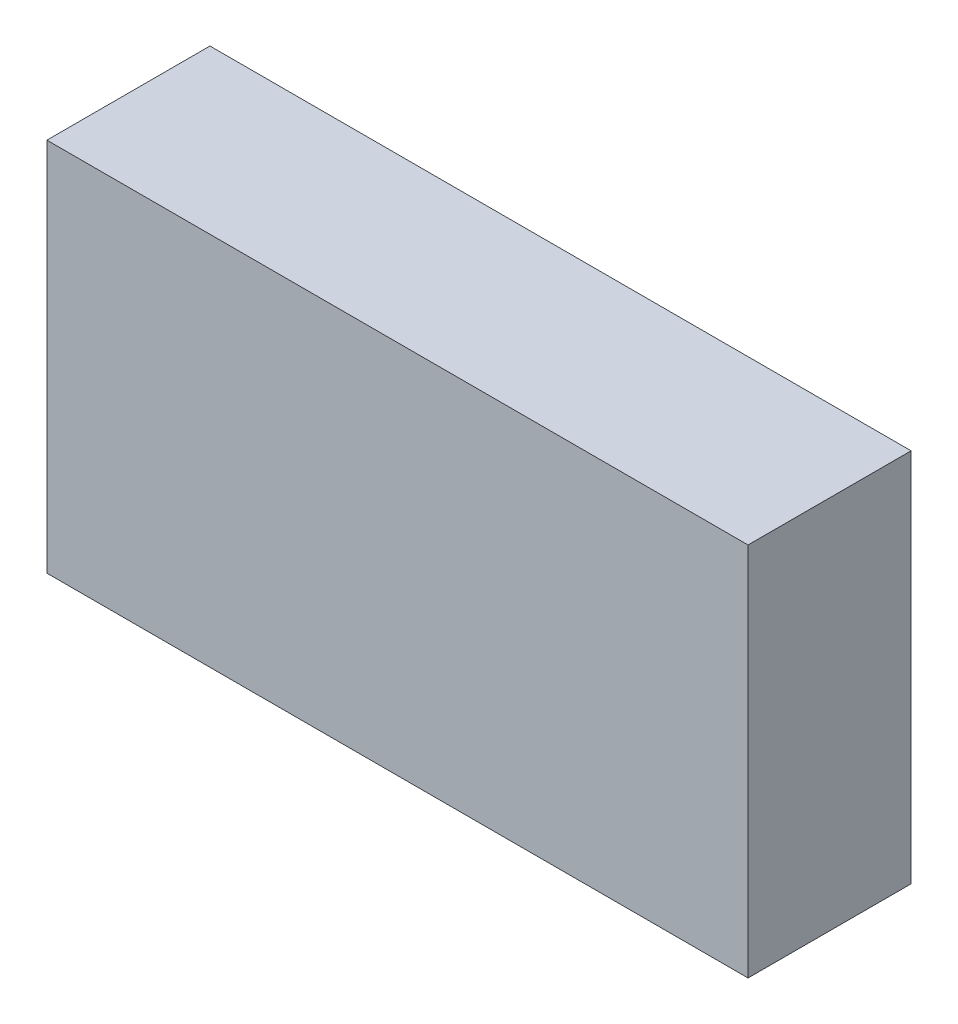
ISO-10303-21;
HEADER;
FILE_DESCRIPTION(('STEP AP214'),'2;1');
FILE_NAME('part.step','',(''),(''),'','','');
FILE_SCHEMA(('AUTOMOTIVE_DESIGN { 1 0 10303 214 1 1 1 1 }'));
ENDSEC;
DATA;
#1=APPLICATION_CONTEXT('core data for automotive mechanical design processes');
#2=APPLICATION_PROTOCOL_DEFINITION('international standard','automotive_design',2000,#1);
#3=PRODUCT_CONTEXT('',#1,'mechanical');
#4=PRODUCT('Part','Part','',(#3));
#5=PRODUCT_RELATED_PRODUCT_CATEGORY('part','',(#4));
#6=PRODUCT_DEFINITION_FORMATION('','',#4);
#7=PRODUCT_DEFINITION_CONTEXT('part definition',#1,'design');
#8=PRODUCT_DEFINITION('design','',#6,#7);
#9=PRODUCT_DEFINITION_SHAPE('','',#8);
#10=(LENGTH_UNIT() NAMED_UNIT(*) SI_UNIT(.MILLI.,.METRE.));
#11=(NAMED_UNIT(*) PLANE_ANGLE_UNIT() SI_UNIT($,.RADIAN.));
#12=(NAMED_UNIT(*) SI_UNIT($,.STERADIAN.) SOLID_ANGLE_UNIT());
#13=UNCERTAINTY_MEASURE_WITH_UNIT(LENGTH_MEASURE(1.E-05),#10,'distance_accuracy_value','');
#14=(GEOMETRIC_REPRESENTATION_CONTEXT(3) GLOBAL_UNCERTAINTY_ASSIGNED_CONTEXT((#13)) GLOBAL_UNIT_ASSIGNED_CONTEXT((#10,
#11,#12)) REPRESENTATION_CONTEXT('',''));
#15=CARTESIAN_POINT('',(0.,0.,0.));
#16=DIRECTION('',(0.,0.,1.));
#17=DIRECTION('',(1.,0.,0.));
#18=AXIS2_PLACEMENT_3D('',#15,#16,#17);
#19=CARTESIAN_POINT('',(0.,0.,50.));
#20=DIRECTION('',(1.,0.,0.));
#21=DIRECTION('',(0.,0.,-1.));
#22=AXIS2_PLACEMENT_3D('',#19,#20,#21);
#23=PLANE('',#22);
#24=DIRECTION('',(0.,-1.,0.));
#25=VECTOR('',#24,1.);
#26=CARTESIAN_POINT('',(0.,0.,0.));
#27=LINE('',#26,#25);
#28=CARTESIAN_POINT('',(0.,115.,0.));
#29=VERTEX_POINT('',#28);
#30=CARTESIAN_POINT('',(0.,0.,0.));
#31=VERTEX_POINT('',#30);
#32=EDGE_CURVE('E107',#29,#31,#27,.T.);
#33=ORIENTED_EDGE('',*,*,#32,.T.);
#34=DIRECTION('',(0.,0.,-1.));
#35=VECTOR('',#34,1.);
#36=CARTESIAN_POINT('',(0.,0.,50.));
#37=LINE('',#36,#35);
#38=CARTESIAN_POINT('',(0.,0.,50.));
#39=VERTEX_POINT('',#38);
#40=EDGE_CURVE('E11',#39,#31,#37,.T.);
#41=ORIENTED_EDGE('',*,*,#40,.F.);
#42=DIRECTION('',(0.,-1.,0.));
#43=VECTOR('',#42,1.);
#44=CARTESIAN_POINT('',(0.,0.,50.));
#45=LINE('',#44,#43);
#46=CARTESIAN_POINT('',(0.,115.,50.));
#47=VERTEX_POINT('',#46);
#48=EDGE_CURVE('E91',#47,#39,#45,.T.);
#49=ORIENTED_EDGE('',*,*,#48,.F.);
#50=DIRECTION('',(0.,0.,-1.));
#51=VECTOR('',#50,1.);
#52=CARTESIAN_POINT('',(0.,115.,50.));
#53=LINE('',#52,#51);
#54=EDGE_CURVE('E103',#47,#29,#53,.T.);
#55=ORIENTED_EDGE('',*,*,#54,.T.);
#56=EDGE_LOOP('',(#33,#41,#49,#55));
#57=FACE_BOUND('',#56,.T.);
#58=ADVANCED_FACE('F39',(#57),#23,.F.);
#59=CARTESIAN_POINT('',(0.,0.,50.));
#60=DIRECTION('',(0.,1.,0.));
#61=DIRECTION('',(0.,0.,1.));
#62=AXIS2_PLACEMENT_3D('',#59,#60,#61);
#63=PLANE('',#62);
#64=DIRECTION('',(1.,0.,0.));
#65=VECTOR('',#64,1.);
#66=CARTESIAN_POINT('',(0.,0.,0.));
#67=LINE('',#66,#65);
#68=CARTESIAN_POINT('',(215.,0.,0.));
#69=VERTEX_POINT('',#68);
#70=EDGE_CURVE('E96',#31,#69,#67,.T.);
#71=ORIENTED_EDGE('',*,*,#70,.T.);
#72=DIRECTION('',(0.,0.,-1.));
#73=VECTOR('',#72,1.);
#74=CARTESIAN_POINT('',(215.,0.,50.));
#75=LINE('',#74,#73);
#76=CARTESIAN_POINT('',(215.,0.,50.));
#77=VERTEX_POINT('',#76);
#78=EDGE_CURVE('E48',#77,#69,#75,.T.);
#79=ORIENTED_EDGE('',*,*,#78,.F.);
#80=DIRECTION('',(1.,0.,0.));
#81=VECTOR('',#80,1.);
#82=CARTESIAN_POINT('',(0.,0.,50.));
#83=LINE('',#82,#81);
#84=EDGE_CURVE('E86',#39,#77,#83,.T.);
#85=ORIENTED_EDGE('',*,*,#84,.F.);
#86=ORIENTED_EDGE('',*,*,#40,.T.);
#87=EDGE_LOOP('',(#71,#79,#85,#86));
#88=FACE_BOUND('',#87,.T.);
#89=ADVANCED_FACE('F95',(#88),#63,.F.);
#90=CARTESIAN_POINT('',(215.,0.,50.));
#91=DIRECTION('',(-1.,0.,0.));
#92=DIRECTION('',(0.,0.,1.));
#93=AXIS2_PLACEMENT_3D('',#90,#91,#92);
#94=PLANE('',#93);
#95=DIRECTION('',(0.,1.,0.));
#96=VECTOR('',#95,1.);
#97=CARTESIAN_POINT('',(215.,0.,0.));
#98=LINE('',#97,#96);
#99=CARTESIAN_POINT('',(215.,115.,0.));
#100=VERTEX_POINT('',#99);
#101=EDGE_CURVE('E73',#69,#100,#98,.T.);
#102=ORIENTED_EDGE('',*,*,#101,.T.);
#103=DIRECTION('',(0.,0.,-1.));
#104=VECTOR('',#103,1.);
#105=CARTESIAN_POINT('',(215.,115.,50.));
#106=LINE('',#105,#104);
#107=CARTESIAN_POINT('',(215.,115.,50.));
#108=VERTEX_POINT('',#107);
#109=EDGE_CURVE('E98',#108,#100,#106,.T.);
#110=ORIENTED_EDGE('',*,*,#109,.F.);
#111=DIRECTION('',(0.,1.,0.));
#112=VECTOR('',#111,1.);
#113=CARTESIAN_POINT('',(215.,0.,50.));
#114=LINE('',#113,#112);
#115=EDGE_CURVE('E89',#77,#108,#114,.T.);
#116=ORIENTED_EDGE('',*,*,#115,.F.);
#117=ORIENTED_EDGE('',*,*,#78,.T.);
#118=EDGE_LOOP('',(#102,#110,#116,#117));
#119=FACE_BOUND('',#118,.T.);
#120=ADVANCED_FACE('F99',(#119),#94,.F.);
#121=CARTESIAN_POINT('',(0.,115.,50.));
#122=DIRECTION('',(0.,-1.,0.));
#123=DIRECTION('',(0.,0.,-1.));
#124=AXIS2_PLACEMENT_3D('',#121,#122,#123);
#125=PLANE('',#124);
#126=DIRECTION('',(-1.,0.,0.));
#127=VECTOR('',#126,1.);
#128=CARTESIAN_POINT('',(0.,115.,0.));
#129=LINE('',#128,#127);
#130=EDGE_CURVE('E79',#100,#29,#129,.T.);
#131=ORIENTED_EDGE('',*,*,#130,.T.);
#132=ORIENTED_EDGE('',*,*,#54,.F.);
#133=DIRECTION('',(-1.,0.,0.));
#134=VECTOR('',#133,1.);
#135=CARTESIAN_POINT('',(0.,115.,50.));
#136=LINE('',#135,#134);
#137=EDGE_CURVE('E56',#108,#47,#136,.T.);
#138=ORIENTED_EDGE('',*,*,#137,.F.);
#139=ORIENTED_EDGE('',*,*,#109,.T.);
#140=EDGE_LOOP('',(#131,#132,#138,#139));
#141=FACE_BOUND('',#140,.T.);
#142=ADVANCED_FACE('F120',(#141),#125,.F.);
#143=CARTESIAN_POINT('',(0.,0.,50.));
#144=DIRECTION('',(0.,0.,-1.));
#145=DIRECTION('',(-1.,0.,0.));
#146=AXIS2_PLACEMENT_3D('',#143,#144,#145);
#147=PLANE('',#146);
#148=ORIENTED_EDGE('',*,*,#48,.T.);
#149=ORIENTED_EDGE('',*,*,#84,.T.);
#150=ORIENTED_EDGE('',*,*,#115,.T.);
#151=ORIENTED_EDGE('',*,*,#137,.T.);
#152=EDGE_LOOP('',(#148,#149,#150,#151));
#153=FACE_BOUND('',#152,.T.);
#154=ADVANCED_FACE('F87',(#153),#147,.F.);
#155=CARTESIAN_POINT('',(0.,0.,0.));
#156=DIRECTION('',(0.,0.,-1.));
#157=DIRECTION('',(-1.,0.,0.));
#158=AXIS2_PLACEMENT_3D('',#155,#156,#157);
#159=PLANE('',#158);
#160=ORIENTED_EDGE('',*,*,#32,.F.);
#161=ORIENTED_EDGE('',*,*,#130,.F.);
#162=ORIENTED_EDGE('',*,*,#101,.F.);
#163=ORIENTED_EDGE('',*,*,#70,.F.);
#164=EDGE_LOOP('',(#160,#161,#162,#163));
#165=FACE_BOUND('',#164,.T.);
#166=ADVANCED_FACE('F123',(#165),#159,.T.);
#167=CLOSED_SHELL('',(#58,#89,#120,#142,#154,#166));
#168=MANIFOLD_SOLID_BREP('B2',#167);
#169=ADVANCED_BREP_SHAPE_REPRESENTATION('',(#18,#168),#14);
#170=SHAPE_DEFINITION_REPRESENTATION(#9,#169);
ENDSEC;
END-ISO-10303-21;
